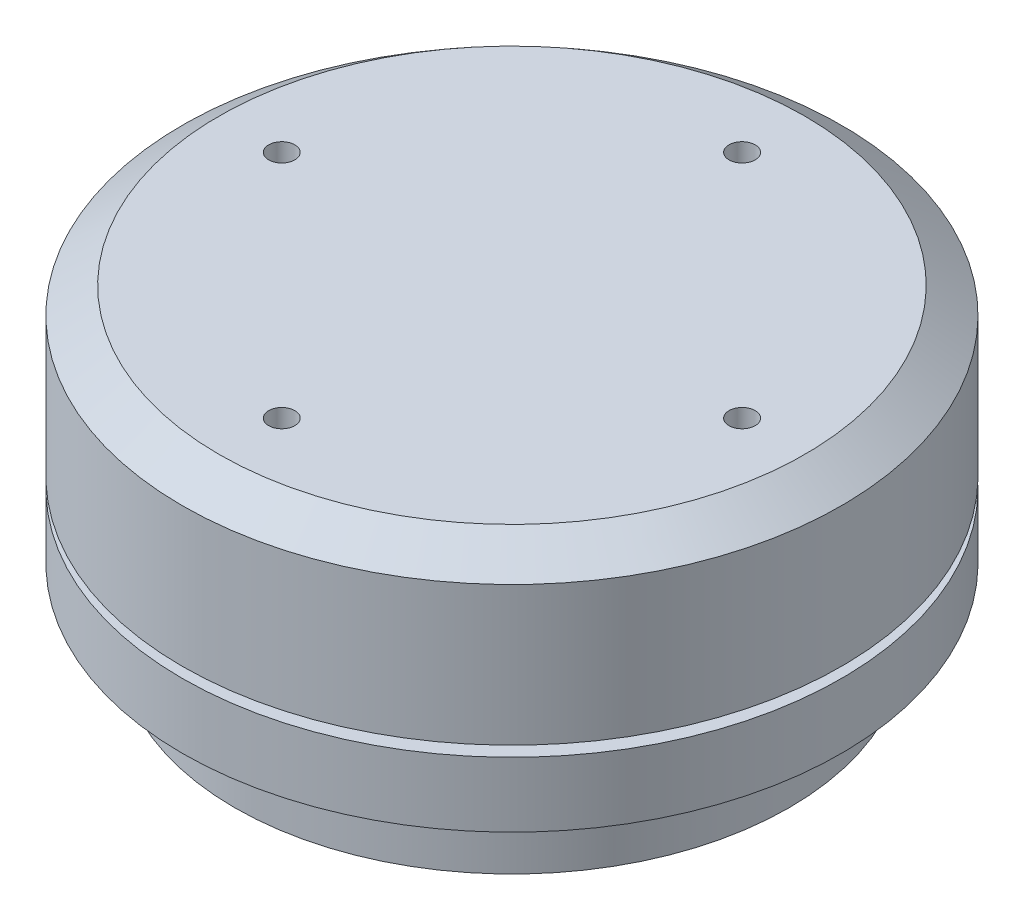
ISO-10303-21;
HEADER;
FILE_DESCRIPTION(('STEP AP214'),'2;1');
FILE_NAME('part.step','',(''),(''),'','','');
FILE_SCHEMA(('AUTOMOTIVE_DESIGN { 1 0 10303 214 1 1 1 1 }'));
ENDSEC;
DATA;
#1=APPLICATION_CONTEXT('core data for automotive mechanical design processes');
#2=APPLICATION_PROTOCOL_DEFINITION('international standard','automotive_design',2000,#1);
#3=PRODUCT_CONTEXT('',#1,'mechanical');
#4=PRODUCT('Part','Part','',(#3));
#5=PRODUCT_RELATED_PRODUCT_CATEGORY('part','',(#4));
#6=PRODUCT_DEFINITION_FORMATION('','',#4);
#7=PRODUCT_DEFINITION_CONTEXT('part definition',#1,'design');
#8=PRODUCT_DEFINITION('design','',#6,#7);
#9=PRODUCT_DEFINITION_SHAPE('','',#8);
#10=(LENGTH_UNIT() NAMED_UNIT(*) SI_UNIT(.MILLI.,.METRE.));
#11=(NAMED_UNIT(*) PLANE_ANGLE_UNIT() SI_UNIT($,.RADIAN.));
#12=(NAMED_UNIT(*) SI_UNIT($,.STERADIAN.) SOLID_ANGLE_UNIT());
#13=UNCERTAINTY_MEASURE_WITH_UNIT(LENGTH_MEASURE(1.E-05),#10,'distance_accuracy_value','');
#14=(GEOMETRIC_REPRESENTATION_CONTEXT(3) GLOBAL_UNCERTAINTY_ASSIGNED_CONTEXT((#13)) GLOBAL_UNIT_ASSIGNED_CONTEXT((#10,
#11,#12)) REPRESENTATION_CONTEXT('',''));
#15=CARTESIAN_POINT('',(0.,0.,0.));
#16=DIRECTION('',(0.,0.,1.));
#17=DIRECTION('',(1.,0.,0.));
#18=AXIS2_PLACEMENT_3D('',#15,#16,#17);
#19=CARTESIAN_POINT('',(-26.5,0.,0.));
#20=DIRECTION('',(0.,-1.,0.));
#21=DIRECTION('',(0.,0.,-1.));
#22=AXIS2_PLACEMENT_3D('',#19,#20,#21);
#23=PLANE('',#22);
#24=CARTESIAN_POINT('',(0.,0.,-15.));
#25=DIRECTION('',(0.,-1.,0.));
#26=DIRECTION('',(0.,0.,-1.));
#27=AXIS2_PLACEMENT_3D('',#24,#25,#26);
#28=CIRCLE('',#27,1.24999999999999);
#29=CARTESIAN_POINT('',(0.,0.,-16.25));
#30=VERTEX_POINT('',#29);
#31=EDGE_CURVE('E81',#30,#30,#28,.T.);
#32=ORIENTED_EDGE('',*,*,#31,.F.);
#33=EDGE_LOOP('',(#32));
#34=FACE_BOUND('',#33,.T.);
#35=CARTESIAN_POINT('',(0.,0.,15.));
#36=DIRECTION('',(0.,-1.,0.));
#37=DIRECTION('',(0.,0.,-1.));
#38=AXIS2_PLACEMENT_3D('',#35,#36,#37);
#39=CIRCLE('',#38,1.24999999999999);
#40=CARTESIAN_POINT('',(0.,0.,13.75));
#41=VERTEX_POINT('',#40);
#42=EDGE_CURVE('E80',#41,#41,#39,.T.);
#43=ORIENTED_EDGE('',*,*,#42,.F.);
#44=EDGE_LOOP('',(#43));
#45=FACE_BOUND('',#44,.T.);
#46=CARTESIAN_POINT('',(-15.,0.,0.));
#47=DIRECTION('',(0.,-1.,0.));
#48=DIRECTION('',(0.,0.,-1.));
#49=AXIS2_PLACEMENT_3D('',#46,#47,#48);
#50=CIRCLE('',#49,1.24999999999999);
#51=CARTESIAN_POINT('',(-15.,0.,-1.24999999999999));
#52=VERTEX_POINT('',#51);
#53=EDGE_CURVE('E91',#52,#52,#50,.T.);
#54=ORIENTED_EDGE('',*,*,#53,.F.);
#55=EDGE_LOOP('',(#54));
#56=FACE_BOUND('',#55,.T.);
#57=CARTESIAN_POINT('',(15.,0.,0.));
#58=DIRECTION('',(0.,-1.,0.));
#59=DIRECTION('',(0.,0.,-1.));
#60=AXIS2_PLACEMENT_3D('',#57,#58,#59);
#61=CIRCLE('',#60,1.24999999999999);
#62=CARTESIAN_POINT('',(15.,0.,-1.24999999999998));
#63=VERTEX_POINT('',#62);
#64=EDGE_CURVE('E97',#63,#63,#61,.T.);
#65=ORIENTED_EDGE('',*,*,#64,.F.);
#66=EDGE_LOOP('',(#65));
#67=FACE_BOUND('',#66,.T.);
#68=CARTESIAN_POINT('',(0.,0.,0.));
#69=DIRECTION('',(0.,1.,0.));
#70=DIRECTION('',(0.,0.,1.));
#71=AXIS2_PLACEMENT_3D('',#68,#69,#70);
#72=CIRCLE('',#71,26.5);
#73=CARTESIAN_POINT('',(0.,0.,26.5));
#74=VERTEX_POINT('',#73);
#75=EDGE_CURVE('E127',#74,#74,#72,.T.);
#76=ORIENTED_EDGE('',*,*,#75,.F.);
#77=EDGE_LOOP('',(#76));
#78=FACE_BOUND('',#77,.T.);
#79=ADVANCED_FACE('F38',(#34,#45,#56,#67,#78),#23,.T.);
#80=CARTESIAN_POINT('',(0.,30.,0.));
#81=DIRECTION('',(0.,1.,0.));
#82=DIRECTION('',(0.,0.,1.));
#83=AXIS2_PLACEMENT_3D('',#80,#81,#82);
#84=PLANE('',#83);
#85=CARTESIAN_POINT('',(0.,30.,-22.));
#86=DIRECTION('',(0.,1.,0.));
#87=DIRECTION('',(0.,0.,1.));
#88=AXIS2_PLACEMENT_3D('',#85,#86,#87);
#89=CIRCLE('',#88,1.24999999999999);
#90=CARTESIAN_POINT('',(0.,30.,-20.75));
#91=VERTEX_POINT('',#90);
#92=EDGE_CURVE('E103',#91,#91,#89,.T.);
#93=ORIENTED_EDGE('',*,*,#92,.F.);
#94=EDGE_LOOP('',(#93));
#95=FACE_BOUND('',#94,.T.);
#96=CARTESIAN_POINT('',(0.,30.,22.));
#97=DIRECTION('',(0.,1.,0.));
#98=DIRECTION('',(0.,0.,1.));
#99=AXIS2_PLACEMENT_3D('',#96,#97,#98);
#100=CIRCLE('',#99,1.24999999999999);
#101=CARTESIAN_POINT('',(0.,30.,23.25));
#102=VERTEX_POINT('',#101);
#103=EDGE_CURVE('E109',#102,#102,#100,.T.);
#104=ORIENTED_EDGE('',*,*,#103,.F.);
#105=EDGE_LOOP('',(#104));
#106=FACE_BOUND('',#105,.T.);
#107=CARTESIAN_POINT('',(22.,30.,0.));
#108=DIRECTION('',(0.,1.,0.));
#109=DIRECTION('',(0.,0.,1.));
#110=AXIS2_PLACEMENT_3D('',#107,#108,#109);
#111=CIRCLE('',#110,1.24999999999999);
#112=CARTESIAN_POINT('',(22.,30.,1.24999999999999));
#113=VERTEX_POINT('',#112);
#114=EDGE_CURVE('E115',#113,#113,#111,.T.);
#115=ORIENTED_EDGE('',*,*,#114,.F.);
#116=EDGE_LOOP('',(#115));
#117=FACE_BOUND('',#116,.T.);
#118=CARTESIAN_POINT('',(-22.,30.,0.));
#119=DIRECTION('',(0.,1.,0.));
#120=DIRECTION('',(0.,0.,1.));
#121=AXIS2_PLACEMENT_3D('',#118,#119,#120);
#122=CIRCLE('',#121,1.24999999999999);
#123=CARTESIAN_POINT('',(-22.,30.,1.24999999999999));
#124=VERTEX_POINT('',#123);
#125=EDGE_CURVE('E121',#124,#124,#122,.T.);
#126=ORIENTED_EDGE('',*,*,#125,.F.);
#127=EDGE_LOOP('',(#126));
#128=FACE_BOUND('',#127,.T.);
#129=CARTESIAN_POINT('',(0.,30.,0.));
#130=DIRECTION('',(0.,1.,0.));
#131=DIRECTION('',(0.,0.,1.));
#132=AXIS2_PLACEMENT_3D('',#129,#130,#131);
#133=CIRCLE('',#132,28.);
#134=CARTESIAN_POINT('',(0.,30.,28.));
#135=VERTEX_POINT('',#134);
#136=EDGE_CURVE('E11',#135,#135,#133,.T.);
#137=ORIENTED_EDGE('',*,*,#136,.T.);
#138=EDGE_LOOP('',(#137));
#139=FACE_BOUND('',#138,.T.);
#140=ADVANCED_FACE('F165',(#95,#106,#117,#128,#139),#84,.T.);
#141=CARTESIAN_POINT('',(0.,30.,0.));
#142=DIRECTION('',(0.,-1.,0.));
#143=DIRECTION('',(0.,0.,-1.));
#144=AXIS2_PLACEMENT_3D('',#141,#142,#143);
#145=CONICAL_SURFACE('',#144,28.,0.950546840812076);
#146=CARTESIAN_POINT('',(0.,27.5,0.));
#147=DIRECTION('',(0.,1.,0.));
#148=DIRECTION('',(0.,0.,1.));
#149=AXIS2_PLACEMENT_3D('',#146,#147,#148);
#150=CIRCLE('',#149,31.5);
#151=CARTESIAN_POINT('',(0.,27.5,31.5));
#152=VERTEX_POINT('',#151);
#153=EDGE_CURVE('E45',#152,#152,#150,.T.);
#154=ORIENTED_EDGE('',*,*,#153,.T.);
#155=EDGE_LOOP('',(#154));
#156=FACE_BOUND('',#155,.T.);
#157=ORIENTED_EDGE('',*,*,#136,.F.);
#158=EDGE_LOOP('',(#157));
#159=FACE_BOUND('',#158,.T.);
#160=ADVANCED_FACE('F150',(#156,#159),#145,.T.);
#161=CARTESIAN_POINT('',(0.,0.,0.));
#162=DIRECTION('',(0.,1.,0.));
#163=DIRECTION('',(0.,0.,1.));
#164=AXIS2_PLACEMENT_3D('',#161,#162,#163);
#165=CYLINDRICAL_SURFACE('',#164,31.5);
#166=CARTESIAN_POINT('',(0.,14.2,0.));
#167=DIRECTION('',(0.,1.,0.));
#168=DIRECTION('',(0.,0.,1.));
#169=AXIS2_PLACEMENT_3D('',#166,#167,#168);
#170=CIRCLE('',#169,31.5);
#171=CARTESIAN_POINT('',(0.,14.2,31.5));
#172=VERTEX_POINT('',#171);
#173=EDGE_CURVE('E145',#172,#172,#170,.T.);
#174=ORIENTED_EDGE('',*,*,#173,.T.);
#175=EDGE_LOOP('',(#174));
#176=FACE_BOUND('',#175,.T.);
#177=ORIENTED_EDGE('',*,*,#153,.F.);
#178=EDGE_LOOP('',(#177));
#179=FACE_BOUND('',#178,.T.);
#180=ADVANCED_FACE('F153',(#176,#179),#165,.T.);
#181=CARTESIAN_POINT('',(-31.5,14.2,0.));
#182=DIRECTION('',(0.,-1.,0.));
#183=DIRECTION('',(0.,0.,-1.));
#184=AXIS2_PLACEMENT_3D('',#181,#182,#183);
#185=PLANE('',#184);
#186=CARTESIAN_POINT('',(0.,14.2,0.));
#187=DIRECTION('',(0.,1.,0.));
#188=DIRECTION('',(0.,0.,1.));
#189=AXIS2_PLACEMENT_3D('',#186,#187,#188);
#190=CIRCLE('',#189,29.5);
#191=CARTESIAN_POINT('',(0.,14.2,29.5));
#192=VERTEX_POINT('',#191);
#193=EDGE_CURVE('E142',#192,#192,#190,.T.);
#194=ORIENTED_EDGE('',*,*,#193,.T.);
#195=EDGE_LOOP('',(#194));
#196=FACE_BOUND('',#195,.T.);
#197=ORIENTED_EDGE('',*,*,#173,.F.);
#198=EDGE_LOOP('',(#197));
#199=FACE_BOUND('',#198,.T.);
#200=ADVANCED_FACE('F155',(#196,#199),#185,.T.);
#201=CARTESIAN_POINT('',(0.,0.,0.));
#202=DIRECTION('',(0.,1.,0.));
#203=DIRECTION('',(0.,0.,1.));
#204=AXIS2_PLACEMENT_3D('',#201,#202,#203);
#205=CYLINDRICAL_SURFACE('',#204,29.5);
#206=CARTESIAN_POINT('',(0.,13.2,0.));
#207=DIRECTION('',(0.,1.,0.));
#208=DIRECTION('',(0.,0.,1.));
#209=AXIS2_PLACEMENT_3D('',#206,#207,#208);
#210=CIRCLE('',#209,29.5);
#211=CARTESIAN_POINT('',(0.,13.2,29.5));
#212=VERTEX_POINT('',#211);
#213=EDGE_CURVE('E139',#212,#212,#210,.T.);
#214=ORIENTED_EDGE('',*,*,#213,.T.);
#215=EDGE_LOOP('',(#214));
#216=FACE_BOUND('',#215,.T.);
#217=ORIENTED_EDGE('',*,*,#193,.F.);
#218=EDGE_LOOP('',(#217));
#219=FACE_BOUND('',#218,.T.);
#220=ADVANCED_FACE('F162',(#216,#219),#205,.T.);
#221=CARTESIAN_POINT('',(-29.5,13.2,0.));
#222=DIRECTION('',(0.,1.,0.));
#223=DIRECTION('',(0.,0.,1.));
#224=AXIS2_PLACEMENT_3D('',#221,#222,#223);
#225=PLANE('',#224);
#226=CARTESIAN_POINT('',(0.,13.2,0.));
#227=DIRECTION('',(0.,1.,0.));
#228=DIRECTION('',(0.,0.,1.));
#229=AXIS2_PLACEMENT_3D('',#226,#227,#228);
#230=CIRCLE('',#229,31.5);
#231=CARTESIAN_POINT('',(0.,13.2,31.5));
#232=VERTEX_POINT('',#231);
#233=EDGE_CURVE('E136',#232,#232,#230,.T.);
#234=ORIENTED_EDGE('',*,*,#233,.T.);
#235=EDGE_LOOP('',(#234));
#236=FACE_BOUND('',#235,.T.);
#237=ORIENTED_EDGE('',*,*,#213,.F.);
#238=EDGE_LOOP('',(#237));
#239=FACE_BOUND('',#238,.T.);
#240=ADVANCED_FACE('F199',(#236,#239),#225,.T.);
#241=CARTESIAN_POINT('',(0.,0.,0.));
#242=DIRECTION('',(0.,1.,0.));
#243=DIRECTION('',(0.,0.,1.));
#244=AXIS2_PLACEMENT_3D('',#241,#242,#243);
#245=CYLINDRICAL_SURFACE('',#244,31.5);
#246=CARTESIAN_POINT('',(0.,7.,0.));
#247=DIRECTION('',(0.,1.,0.));
#248=DIRECTION('',(0.,0.,1.));
#249=AXIS2_PLACEMENT_3D('',#246,#247,#248);
#250=CIRCLE('',#249,31.5);
#251=CARTESIAN_POINT('',(0.,7.,31.5));
#252=VERTEX_POINT('',#251);
#253=EDGE_CURVE('E133',#252,#252,#250,.T.);
#254=ORIENTED_EDGE('',*,*,#253,.T.);
#255=EDGE_LOOP('',(#254));
#256=FACE_BOUND('',#255,.T.);
#257=ORIENTED_EDGE('',*,*,#233,.F.);
#258=EDGE_LOOP('',(#257));
#259=FACE_BOUND('',#258,.T.);
#260=ADVANCED_FACE('F193',(#256,#259),#245,.T.);
#261=CARTESIAN_POINT('',(0.,7.,0.));
#262=DIRECTION('',(0.,1.,0.));
#263=DIRECTION('',(0.,0.,1.));
#264=AXIS2_PLACEMENT_3D('',#261,#262,#263);
#265=CONICAL_SURFACE('',#264,31.5,1.29778762370819);
#266=CARTESIAN_POINT('',(0.,5.6,0.));
#267=DIRECTION('',(0.,1.,0.));
#268=DIRECTION('',(0.,0.,1.));
#269=AXIS2_PLACEMENT_3D('',#266,#267,#268);
#270=CIRCLE('',#269,26.5);
#271=CARTESIAN_POINT('',(0.,5.6,26.5));
#272=VERTEX_POINT('',#271);
#273=EDGE_CURVE('E130',#272,#272,#270,.T.);
#274=ORIENTED_EDGE('',*,*,#273,.T.);
#275=EDGE_LOOP('',(#274));
#276=FACE_BOUND('',#275,.T.);
#277=ORIENTED_EDGE('',*,*,#253,.F.);
#278=EDGE_LOOP('',(#277));
#279=FACE_BOUND('',#278,.T.);
#280=ADVANCED_FACE('F187',(#276,#279),#265,.T.);
#281=CARTESIAN_POINT('',(0.,0.,0.));
#282=DIRECTION('',(0.,1.,0.));
#283=DIRECTION('',(0.,0.,1.));
#284=AXIS2_PLACEMENT_3D('',#281,#282,#283);
#285=CYLINDRICAL_SURFACE('',#284,26.5);
#286=ORIENTED_EDGE('',*,*,#75,.T.);
#287=EDGE_LOOP('',(#286));
#288=FACE_BOUND('',#287,.T.);
#289=ORIENTED_EDGE('',*,*,#273,.F.);
#290=EDGE_LOOP('',(#289));
#291=FACE_BOUND('',#290,.T.);
#292=ADVANCED_FACE('F183',(#288,#291),#285,.T.);
#293=CARTESIAN_POINT('',(-22.,24.,0.));
#294=DIRECTION('',(0.,1.,0.));
#295=DIRECTION('',(0.,0.,1.));
#296=AXIS2_PLACEMENT_3D('',#293,#294,#295);
#297=CONICAL_SURFACE('',#296,1.25,1.02974425867665);
#298=CARTESIAN_POINT('',(-22.,23.2489242262155,0.));
#299=VERTEX_POINT('',#298);
#300=VERTEX_LOOP('',#299);
#301=FACE_BOUND('',#300,.T.);
#302=CARTESIAN_POINT('',(-22.,24.,0.));
#303=DIRECTION('',(0.,1.,0.));
#304=DIRECTION('',(0.,0.,1.));
#305=AXIS2_PLACEMENT_3D('',#302,#303,#304);
#306=CIRCLE('',#305,1.25);
#307=CARTESIAN_POINT('',(-22.,24.,1.25));
#308=VERTEX_POINT('',#307);
#309=EDGE_CURVE('E124',#308,#308,#306,.T.);
#310=ORIENTED_EDGE('',*,*,#309,.T.);
#311=EDGE_LOOP('',(#310));
#312=FACE_BOUND('',#311,.T.);
#313=ADVANCED_FACE('F186',(#301,#312),#297,.F.);
#314=CARTESIAN_POINT('',(-22.,30.,0.));
#315=DIRECTION('',(0.,1.,0.));
#316=DIRECTION('',(0.,0.,1.));
#317=AXIS2_PLACEMENT_3D('',#314,#315,#316);
#318=CYLINDRICAL_SURFACE('',#317,1.24999999999999);
#319=ORIENTED_EDGE('',*,*,#309,.F.);
#320=EDGE_LOOP('',(#319));
#321=FACE_BOUND('',#320,.T.);
#322=ORIENTED_EDGE('',*,*,#125,.T.);
#323=EDGE_LOOP('',(#322));
#324=FACE_BOUND('',#323,.T.);
#325=ADVANCED_FACE('F219',(#321,#324),#318,.F.);
#326=CARTESIAN_POINT('',(22.,24.,0.));
#327=DIRECTION('',(0.,1.,0.));
#328=DIRECTION('',(0.,0.,1.));
#329=AXIS2_PLACEMENT_3D('',#326,#327,#328);
#330=CONICAL_SURFACE('',#329,1.25,1.02974425867665);
#331=CARTESIAN_POINT('',(22.,23.2489242262155,0.));
#332=VERTEX_POINT('',#331);
#333=VERTEX_LOOP('',#332);
#334=FACE_BOUND('',#333,.T.);
#335=CARTESIAN_POINT('',(22.,24.,0.));
#336=DIRECTION('',(0.,1.,0.));
#337=DIRECTION('',(0.,0.,1.));
#338=AXIS2_PLACEMENT_3D('',#335,#336,#337);
#339=CIRCLE('',#338,1.25);
#340=CARTESIAN_POINT('',(22.,24.,1.25));
#341=VERTEX_POINT('',#340);
#342=EDGE_CURVE('E118',#341,#341,#339,.T.);
#343=ORIENTED_EDGE('',*,*,#342,.T.);
#344=EDGE_LOOP('',(#343));
#345=FACE_BOUND('',#344,.T.);
#346=ADVANCED_FACE('F222',(#334,#345),#330,.F.);
#347=CARTESIAN_POINT('',(22.,30.,0.));
#348=DIRECTION('',(0.,1.,0.));
#349=DIRECTION('',(0.,0.,1.));
#350=AXIS2_PLACEMENT_3D('',#347,#348,#349);
#351=CYLINDRICAL_SURFACE('',#350,1.24999999999999);
#352=ORIENTED_EDGE('',*,*,#342,.F.);
#353=EDGE_LOOP('',(#352));
#354=FACE_BOUND('',#353,.T.);
#355=ORIENTED_EDGE('',*,*,#114,.T.);
#356=EDGE_LOOP('',(#355));
#357=FACE_BOUND('',#356,.T.);
#358=ADVANCED_FACE('F226',(#354,#357),#351,.F.);
#359=CARTESIAN_POINT('',(0.,24.,22.));
#360=DIRECTION('',(0.,1.,0.));
#361=DIRECTION('',(0.,0.,1.));
#362=AXIS2_PLACEMENT_3D('',#359,#360,#361);
#363=CONICAL_SURFACE('',#362,1.25,1.02974425867665);
#364=CARTESIAN_POINT('',(0.,23.2489242262155,22.));
#365=VERTEX_POINT('',#364);
#366=VERTEX_LOOP('',#365);
#367=FACE_BOUND('',#366,.T.);
#368=CARTESIAN_POINT('',(0.,24.,22.));
#369=DIRECTION('',(0.,1.,0.));
#370=DIRECTION('',(0.,0.,1.));
#371=AXIS2_PLACEMENT_3D('',#368,#369,#370);
#372=CIRCLE('',#371,1.25);
#373=CARTESIAN_POINT('',(0.,24.,23.25));
#374=VERTEX_POINT('',#373);
#375=EDGE_CURVE('E112',#374,#374,#372,.T.);
#376=ORIENTED_EDGE('',*,*,#375,.T.);
#377=EDGE_LOOP('',(#376));
#378=FACE_BOUND('',#377,.T.);
#379=ADVANCED_FACE('F229',(#367,#378),#363,.F.);
#380=CARTESIAN_POINT('',(0.,30.,22.));
#381=DIRECTION('',(0.,1.,0.));
#382=DIRECTION('',(0.,0.,1.));
#383=AXIS2_PLACEMENT_3D('',#380,#381,#382);
#384=CYLINDRICAL_SURFACE('',#383,1.24999999999999);
#385=ORIENTED_EDGE('',*,*,#375,.F.);
#386=EDGE_LOOP('',(#385));
#387=FACE_BOUND('',#386,.T.);
#388=ORIENTED_EDGE('',*,*,#103,.T.);
#389=EDGE_LOOP('',(#388));
#390=FACE_BOUND('',#389,.T.);
#391=ADVANCED_FACE('F233',(#387,#390),#384,.F.);
#392=CARTESIAN_POINT('',(0.,24.,-22.));
#393=DIRECTION('',(0.,1.,0.));
#394=DIRECTION('',(0.,0.,1.));
#395=AXIS2_PLACEMENT_3D('',#392,#393,#394);
#396=CONICAL_SURFACE('',#395,1.25,1.02974425867665);
#397=CARTESIAN_POINT('',(0.,23.2489242262155,-22.));
#398=VERTEX_POINT('',#397);
#399=VERTEX_LOOP('',#398);
#400=FACE_BOUND('',#399,.T.);
#401=CARTESIAN_POINT('',(0.,24.,-22.));
#402=DIRECTION('',(0.,1.,0.));
#403=DIRECTION('',(0.,0.,1.));
#404=AXIS2_PLACEMENT_3D('',#401,#402,#403);
#405=CIRCLE('',#404,1.25);
#406=CARTESIAN_POINT('',(0.,24.,-20.75));
#407=VERTEX_POINT('',#406);
#408=EDGE_CURVE('E106',#407,#407,#405,.T.);
#409=ORIENTED_EDGE('',*,*,#408,.T.);
#410=EDGE_LOOP('',(#409));
#411=FACE_BOUND('',#410,.T.);
#412=ADVANCED_FACE('F237',(#400,#411),#396,.F.);
#413=CARTESIAN_POINT('',(0.,30.,-22.));
#414=DIRECTION('',(0.,1.,0.));
#415=DIRECTION('',(0.,0.,1.));
#416=AXIS2_PLACEMENT_3D('',#413,#414,#415);
#417=CYLINDRICAL_SURFACE('',#416,1.24999999999999);
#418=ORIENTED_EDGE('',*,*,#408,.F.);
#419=EDGE_LOOP('',(#418));
#420=FACE_BOUND('',#419,.T.);
#421=ORIENTED_EDGE('',*,*,#92,.T.);
#422=EDGE_LOOP('',(#421));
#423=FACE_BOUND('',#422,.T.);
#424=ADVANCED_FACE('F241',(#420,#423),#417,.F.);
#425=CARTESIAN_POINT('',(15.,8.5,0.));
#426=DIRECTION('',(0.,-1.,0.));
#427=DIRECTION('',(0.,0.,-1.));
#428=AXIS2_PLACEMENT_3D('',#425,#426,#427);
#429=CONICAL_SURFACE('',#428,1.25,1.02974425867665);
#430=CARTESIAN_POINT('',(15.,9.25107577378445,0.));
#431=VERTEX_POINT('',#430);
#432=VERTEX_LOOP('',#431);
#433=FACE_BOUND('',#432,.T.);
#434=CARTESIAN_POINT('',(15.,8.5,0.));
#435=DIRECTION('',(0.,-1.,0.));
#436=DIRECTION('',(0.,0.,-1.));
#437=AXIS2_PLACEMENT_3D('',#434,#435,#436);
#438=CIRCLE('',#437,1.25);
#439=CARTESIAN_POINT('',(15.,8.5,-1.24999999999999));
#440=VERTEX_POINT('',#439);
#441=EDGE_CURVE('E100',#440,#440,#438,.T.);
#442=ORIENTED_EDGE('',*,*,#441,.T.);
#443=EDGE_LOOP('',(#442));
#444=FACE_BOUND('',#443,.T.);
#445=ADVANCED_FACE('F245',(#433,#444),#429,.F.);
#446=CARTESIAN_POINT('',(15.,0.,0.));
#447=DIRECTION('',(0.,-1.,0.));
#448=DIRECTION('',(0.,0.,-1.));
#449=AXIS2_PLACEMENT_3D('',#446,#447,#448);
#450=CYLINDRICAL_SURFACE('',#449,1.24999999999999);
#451=ORIENTED_EDGE('',*,*,#441,.F.);
#452=EDGE_LOOP('',(#451));
#453=FACE_BOUND('',#452,.T.);
#454=ORIENTED_EDGE('',*,*,#64,.T.);
#455=EDGE_LOOP('',(#454));
#456=FACE_BOUND('',#455,.T.);
#457=ADVANCED_FACE('F249',(#453,#456),#450,.F.);
#458=CARTESIAN_POINT('',(-15.,8.5,0.));
#459=DIRECTION('',(0.,-1.,0.));
#460=DIRECTION('',(0.,0.,-1.));
#461=AXIS2_PLACEMENT_3D('',#458,#459,#460);
#462=CONICAL_SURFACE('',#461,1.25,1.02974425867665);
#463=CARTESIAN_POINT('',(-15.,9.25107577378445,0.));
#464=VERTEX_POINT('',#463);
#465=VERTEX_LOOP('',#464);
#466=FACE_BOUND('',#465,.T.);
#467=CARTESIAN_POINT('',(-15.,8.5,0.));
#468=DIRECTION('',(0.,-1.,0.));
#469=DIRECTION('',(0.,0.,-1.));
#470=AXIS2_PLACEMENT_3D('',#467,#468,#469);
#471=CIRCLE('',#470,1.25);
#472=CARTESIAN_POINT('',(-15.,8.5,-1.24999999999999));
#473=VERTEX_POINT('',#472);
#474=EDGE_CURVE('E94',#473,#473,#471,.T.);
#475=ORIENTED_EDGE('',*,*,#474,.T.);
#476=EDGE_LOOP('',(#475));
#477=FACE_BOUND('',#476,.T.);
#478=ADVANCED_FACE('F253',(#466,#477),#462,.F.);
#479=CARTESIAN_POINT('',(-15.,0.,0.));
#480=DIRECTION('',(0.,-1.,0.));
#481=DIRECTION('',(0.,0.,-1.));
#482=AXIS2_PLACEMENT_3D('',#479,#480,#481);
#483=CYLINDRICAL_SURFACE('',#482,1.24999999999999);
#484=ORIENTED_EDGE('',*,*,#474,.F.);
#485=EDGE_LOOP('',(#484));
#486=FACE_BOUND('',#485,.T.);
#487=ORIENTED_EDGE('',*,*,#53,.T.);
#488=EDGE_LOOP('',(#487));
#489=FACE_BOUND('',#488,.T.);
#490=ADVANCED_FACE('F257',(#486,#489),#483,.F.);
#491=CARTESIAN_POINT('',(0.,8.5,15.));
#492=DIRECTION('',(0.,-1.,0.));
#493=DIRECTION('',(0.,0.,-1.));
#494=AXIS2_PLACEMENT_3D('',#491,#492,#493);
#495=CONICAL_SURFACE('',#494,1.25,1.02974425867665);
#496=CARTESIAN_POINT('',(0.,9.25107577378445,15.));
#497=VERTEX_POINT('',#496);
#498=VERTEX_LOOP('',#497);
#499=FACE_BOUND('',#498,.T.);
#500=CARTESIAN_POINT('',(0.,8.5,15.));
#501=DIRECTION('',(0.,-1.,0.));
#502=DIRECTION('',(0.,0.,-1.));
#503=AXIS2_PLACEMENT_3D('',#500,#501,#502);
#504=CIRCLE('',#503,1.25);
#505=CARTESIAN_POINT('',(0.,8.5,13.75));
#506=VERTEX_POINT('',#505);
#507=EDGE_CURVE('E84',#506,#506,#504,.T.);
#508=ORIENTED_EDGE('',*,*,#507,.T.);
#509=EDGE_LOOP('',(#508));
#510=FACE_BOUND('',#509,.T.);
#511=ADVANCED_FACE('F261',(#499,#510),#495,.F.);
#512=CARTESIAN_POINT('',(0.,0.,15.));
#513=DIRECTION('',(0.,-1.,0.));
#514=DIRECTION('',(0.,0.,-1.));
#515=AXIS2_PLACEMENT_3D('',#512,#513,#514);
#516=CYLINDRICAL_SURFACE('',#515,1.24999999999999);
#517=ORIENTED_EDGE('',*,*,#507,.F.);
#518=EDGE_LOOP('',(#517));
#519=FACE_BOUND('',#518,.T.);
#520=ORIENTED_EDGE('',*,*,#42,.T.);
#521=EDGE_LOOP('',(#520));
#522=FACE_BOUND('',#521,.T.);
#523=ADVANCED_FACE('F74',(#519,#522),#516,.F.);
#524=CARTESIAN_POINT('',(0.,8.5,-15.));
#525=DIRECTION('',(0.,-1.,0.));
#526=DIRECTION('',(0.,0.,-1.));
#527=AXIS2_PLACEMENT_3D('',#524,#525,#526);
#528=CONICAL_SURFACE('',#527,1.25,1.02974425867665);
#529=CARTESIAN_POINT('',(0.,9.25107577378445,-15.));
#530=VERTEX_POINT('',#529);
#531=VERTEX_LOOP('',#530);
#532=FACE_BOUND('',#531,.T.);
#533=CARTESIAN_POINT('',(0.,8.5,-15.));
#534=DIRECTION('',(0.,-1.,0.));
#535=DIRECTION('',(0.,0.,-1.));
#536=AXIS2_PLACEMENT_3D('',#533,#534,#535);
#537=CIRCLE('',#536,1.25);
#538=CARTESIAN_POINT('',(0.,8.5,-16.25));
#539=VERTEX_POINT('',#538);
#540=EDGE_CURVE('E78',#539,#539,#537,.T.);
#541=ORIENTED_EDGE('',*,*,#540,.T.);
#542=EDGE_LOOP('',(#541));
#543=FACE_BOUND('',#542,.T.);
#544=ADVANCED_FACE('F70',(#532,#543),#528,.F.);
#545=CARTESIAN_POINT('',(0.,0.,-15.));
#546=DIRECTION('',(0.,-1.,0.));
#547=DIRECTION('',(0.,0.,-1.));
#548=AXIS2_PLACEMENT_3D('',#545,#546,#547);
#549=CYLINDRICAL_SURFACE('',#548,1.24999999999999);
#550=ORIENTED_EDGE('',*,*,#540,.F.);
#551=EDGE_LOOP('',(#550));
#552=FACE_BOUND('',#551,.T.);
#553=ORIENTED_EDGE('',*,*,#31,.T.);
#554=EDGE_LOOP('',(#553));
#555=FACE_BOUND('',#554,.T.);
#556=ADVANCED_FACE('F73',(#552,#555),#549,.F.);
#557=CLOSED_SHELL('',(#79,#140,#160,#180,#200,#220,#240,#260,#280,#292,#313,#325,#346,#358,#379,
#391,#412,#424,#445,#457,#478,#490,#511,#523,#544,#556));
#558=MANIFOLD_SOLID_BREP('B2',#557);
#559=ADVANCED_BREP_SHAPE_REPRESENTATION('',(#18,#558),#14);
#560=SHAPE_DEFINITION_REPRESENTATION(#9,#559);
ENDSEC;
END-ISO-10303-21;
